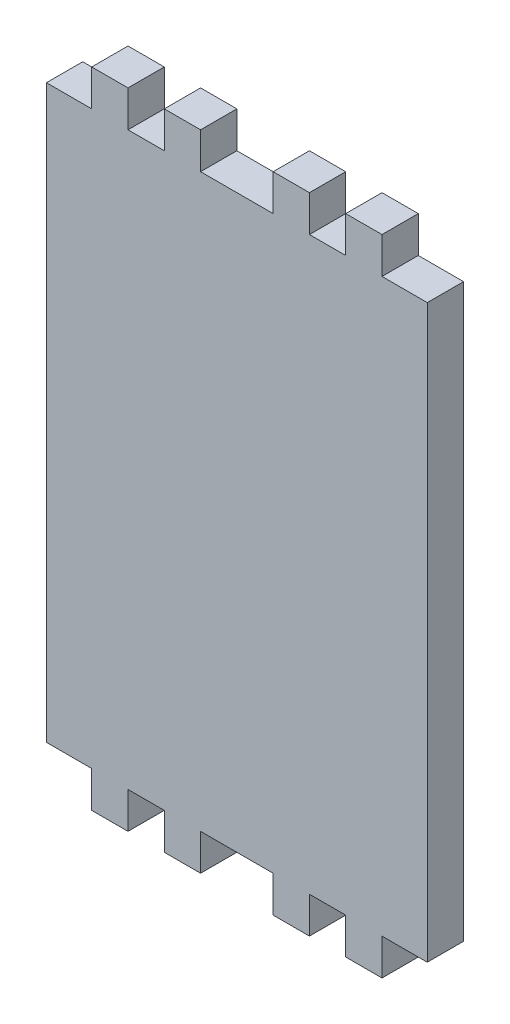
ISO-10303-21;
HEADER;
FILE_DESCRIPTION(('STEP AP214'),'2;1');
FILE_NAME('part.step','',(''),(''),'','','');
FILE_SCHEMA(('AUTOMOTIVE_DESIGN { 1 0 10303 214 1 1 1 1 }'));
ENDSEC;
DATA;
#1=APPLICATION_CONTEXT('core data for automotive mechanical design processes');
#2=APPLICATION_PROTOCOL_DEFINITION('international standard','automotive_design',2000,#1);
#3=PRODUCT_CONTEXT('',#1,'mechanical');
#4=PRODUCT('Part','Part','',(#3));
#5=PRODUCT_RELATED_PRODUCT_CATEGORY('part','',(#4));
#6=PRODUCT_DEFINITION_FORMATION('','',#4);
#7=PRODUCT_DEFINITION_CONTEXT('part definition',#1,'design');
#8=PRODUCT_DEFINITION('design','',#6,#7);
#9=PRODUCT_DEFINITION_SHAPE('','',#8);
#10=(LENGTH_UNIT() NAMED_UNIT(*) SI_UNIT(.MILLI.,.METRE.));
#11=(NAMED_UNIT(*) PLANE_ANGLE_UNIT() SI_UNIT($,.RADIAN.));
#12=(NAMED_UNIT(*) SI_UNIT($,.STERADIAN.) SOLID_ANGLE_UNIT());
#13=UNCERTAINTY_MEASURE_WITH_UNIT(LENGTH_MEASURE(1.E-05),#10,'distance_accuracy_value','');
#14=(GEOMETRIC_REPRESENTATION_CONTEXT(3) GLOBAL_UNCERTAINTY_ASSIGNED_CONTEXT((#13)) GLOBAL_UNIT_ASSIGNED_CONTEXT((#10,
#11,#12)) REPRESENTATION_CONTEXT('',''));
#15=CARTESIAN_POINT('',(0.,0.,0.));
#16=DIRECTION('',(0.,0.,1.));
#17=DIRECTION('',(1.,0.,0.));
#18=AXIS2_PLACEMENT_3D('',#15,#16,#17);
#19=CARTESIAN_POINT('',(-6.95478260869565,-36.6285217391304,5.08));
#20=DIRECTION('',(0.,1.,0.));
#21=DIRECTION('',(0.,0.,1.));
#22=AXIS2_PLACEMENT_3D('',#19,#20,#21);
#23=PLANE('',#22);
#24=DIRECTION('',(1.,0.,0.));
#25=VECTOR('',#24,1.);
#26=CARTESIAN_POINT('',(-6.95478260869565,-36.6285217391304,0.));
#27=LINE('',#26,#25);
#28=CARTESIAN_POINT('',(14.6252173913043,-36.6285217391304,0.));
#29=VERTEX_POINT('',#28);
#30=CARTESIAN_POINT('',(24.7852173913043,-36.6285217391304,0.));
#31=VERTEX_POINT('',#30);
#32=EDGE_CURVE('E519',#29,#31,#27,.T.);
#33=ORIENTED_EDGE('',*,*,#32,.T.);
#34=DIRECTION('',(0.,0.,1.));
#35=VECTOR('',#34,1.);
#36=CARTESIAN_POINT('',(24.7852173913043,-36.6285217391304,0.));
#37=LINE('',#36,#35);
#38=CARTESIAN_POINT('',(24.7852173913043,-36.6285217391304,5.08));
#39=VERTEX_POINT('',#38);
#40=EDGE_CURVE('E55',#31,#39,#37,.T.);
#41=ORIENTED_EDGE('',*,*,#40,.T.);
#42=DIRECTION('',(1.,0.,0.));
#43=VECTOR('',#42,1.);
#44=CARTESIAN_POINT('',(-6.95478260869565,-36.6285217391304,5.08));
#45=LINE('',#44,#43);
#46=CARTESIAN_POINT('',(14.6252173913043,-36.6285217391304,5.08));
#47=VERTEX_POINT('',#46);
#48=EDGE_CURVE('E503',#47,#39,#45,.T.);
#49=ORIENTED_EDGE('',*,*,#48,.F.);
#50=DIRECTION('',(0.,0.,1.));
#51=VECTOR('',#50,1.);
#52=CARTESIAN_POINT('',(14.6252173913043,-36.6285217391304,0.));
#53=LINE('',#52,#51);
#54=EDGE_CURVE('E368',#29,#47,#53,.T.);
#55=ORIENTED_EDGE('',*,*,#54,.F.);
#56=EDGE_LOOP('',(#33,#41,#49,#55));
#57=FACE_BOUND('',#56,.T.);
#58=ADVANCED_FACE('F32',(#57),#23,.F.);
#59=CARTESIAN_POINT('',(40.0252173913043,-36.6285217391304,5.08));
#60=VERTEX_POINT('',#59);
#61=CARTESIAN_POINT('',(46.3652173913043,-36.6285217391304,5.08));
#62=VERTEX_POINT('',#61);
#63=EDGE_CURVE('E496',#60,#62,#45,.T.);
#64=ORIENTED_EDGE('',*,*,#63,.F.);
#65=DIRECTION('',(0.,0.,1.));
#66=VECTOR('',#65,1.);
#67=CARTESIAN_POINT('',(40.0252173913043,-36.6285217391304,0.));
#68=LINE('',#67,#66);
#69=CARTESIAN_POINT('',(40.0252173913043,-36.6285217391304,0.));
#70=VERTEX_POINT('',#69);
#71=EDGE_CURVE('E323',#70,#60,#68,.T.);
#72=ORIENTED_EDGE('',*,*,#71,.F.);
#73=CARTESIAN_POINT('',(46.3652173913043,-36.6285217391304,0.));
#74=VERTEX_POINT('',#73);
#75=EDGE_CURVE('E514',#70,#74,#27,.T.);
#76=ORIENTED_EDGE('',*,*,#75,.T.);
#77=DIRECTION('',(0.,0.,-1.));
#78=VECTOR('',#77,1.);
#79=CARTESIAN_POINT('',(46.3652173913043,-36.6285217391304,5.08));
#80=LINE('',#79,#78);
#81=EDGE_CURVE('E40',#62,#74,#80,.T.);
#82=ORIENTED_EDGE('',*,*,#81,.F.);
#83=EDGE_LOOP('',(#64,#72,#76,#82));
#84=FACE_BOUND('',#83,.T.);
#85=ADVANCED_FACE('F624',(#84),#23,.F.);
#86=CARTESIAN_POINT('',(4.46521739130434,-36.6285217391304,5.08));
#87=VERTEX_POINT('',#86);
#88=CARTESIAN_POINT('',(9.54521739130433,-36.6285217391304,5.08));
#89=VERTEX_POINT('',#88);
#90=EDGE_CURVE('E502',#87,#89,#45,.T.);
#91=ORIENTED_EDGE('',*,*,#90,.F.);
#92=DIRECTION('',(0.,0.,1.));
#93=VECTOR('',#92,1.);
#94=CARTESIAN_POINT('',(4.46521739130434,-36.6285217391304,0.));
#95=LINE('',#94,#93);
#96=CARTESIAN_POINT('',(4.46521739130434,-36.6285217391304,0.));
#97=VERTEX_POINT('',#96);
#98=EDGE_CURVE('E342',#97,#87,#95,.T.);
#99=ORIENTED_EDGE('',*,*,#98,.F.);
#100=CARTESIAN_POINT('',(9.54521739130433,-36.6285217391304,0.));
#101=VERTEX_POINT('',#100);
#102=EDGE_CURVE('E518',#97,#101,#27,.T.);
#103=ORIENTED_EDGE('',*,*,#102,.T.);
#104=DIRECTION('',(0.,0.,1.));
#105=VECTOR('',#104,1.);
#106=CARTESIAN_POINT('',(9.54521739130433,-36.6285217391304,0.));
#107=LINE('',#106,#105);
#108=EDGE_CURVE('E381',#101,#89,#107,.T.);
#109=ORIENTED_EDGE('',*,*,#108,.T.);
#110=EDGE_LOOP('',(#91,#99,#103,#109));
#111=FACE_BOUND('',#110,.T.);
#112=ADVANCED_FACE('F610',(#111),#23,.F.);
#113=CARTESIAN_POINT('',(29.8652173913043,-36.6285217391304,5.08));
#114=VERTEX_POINT('',#113);
#115=CARTESIAN_POINT('',(34.9452173913043,-36.6285217391304,5.08));
#116=VERTEX_POINT('',#115);
#117=EDGE_CURVE('E47',#114,#116,#45,.T.);
#118=ORIENTED_EDGE('',*,*,#117,.F.);
#119=DIRECTION('',(0.,0.,1.));
#120=VECTOR('',#119,1.);
#121=CARTESIAN_POINT('',(29.8652173913043,-36.6285217391304,0.));
#122=LINE('',#121,#120);
#123=CARTESIAN_POINT('',(29.8652173913043,-36.6285217391304,0.));
#124=VERTEX_POINT('',#123);
#125=EDGE_CURVE('E277',#124,#114,#122,.T.);
#126=ORIENTED_EDGE('',*,*,#125,.F.);
#127=CARTESIAN_POINT('',(34.9452173913043,-36.6285217391304,0.));
#128=VERTEX_POINT('',#127);
#129=EDGE_CURVE('E288',#124,#128,#27,.T.);
#130=ORIENTED_EDGE('',*,*,#129,.T.);
#131=DIRECTION('',(0.,0.,1.));
#132=VECTOR('',#131,1.);
#133=CARTESIAN_POINT('',(34.9452173913043,-36.6285217391304,0.));
#134=LINE('',#133,#132);
#135=EDGE_CURVE('E315',#128,#116,#134,.T.);
#136=ORIENTED_EDGE('',*,*,#135,.T.);
#137=EDGE_LOOP('',(#118,#126,#130,#136));
#138=FACE_BOUND('',#137,.T.);
#139=ADVANCED_FACE('F614',(#138),#23,.F.);
#140=CARTESIAN_POINT('',(-6.95478260869566,43.3514782608696,5.08));
#141=DIRECTION('',(0.,-1.,0.));
#142=DIRECTION('',(0.,0.,-1.));
#143=AXIS2_PLACEMENT_3D('',#140,#141,#142);
#144=PLANE('',#143);
#145=DIRECTION('',(-1.,0.,0.));
#146=VECTOR('',#145,1.);
#147=CARTESIAN_POINT('',(-6.95478260869566,43.3514782608696,0.));
#148=LINE('',#147,#146);
#149=CARTESIAN_POINT('',(24.7852173913043,43.3514782608696,0.));
#150=VERTEX_POINT('',#149);
#151=CARTESIAN_POINT('',(14.6252173913043,43.3514782608696,0.));
#152=VERTEX_POINT('',#151);
#153=EDGE_CURVE('E580',#150,#152,#148,.T.);
#154=ORIENTED_EDGE('',*,*,#153,.T.);
#155=DIRECTION('',(0.,0.,1.));
#156=VECTOR('',#155,1.);
#157=CARTESIAN_POINT('',(14.6252173913043,43.3514782608696,0.));
#158=LINE('',#157,#156);
#159=CARTESIAN_POINT('',(14.6252173913043,43.3514782608696,5.08));
#160=VERTEX_POINT('',#159);
#161=EDGE_CURVE('E406',#152,#160,#158,.T.);
#162=ORIENTED_EDGE('',*,*,#161,.T.);
#163=DIRECTION('',(-1.,0.,0.));
#164=VECTOR('',#163,1.);
#165=CARTESIAN_POINT('',(-6.95478260869566,43.3514782608696,5.08));
#166=LINE('',#165,#164);
#167=CARTESIAN_POINT('',(24.7852173913043,43.3514782608696,5.08));
#168=VERTEX_POINT('',#167);
#169=EDGE_CURVE('E562',#168,#160,#166,.T.);
#170=ORIENTED_EDGE('',*,*,#169,.F.);
#171=DIRECTION('',(0.,0.,1.));
#172=VECTOR('',#171,1.);
#173=CARTESIAN_POINT('',(24.7852173913043,43.3514782608696,0.));
#174=LINE('',#173,#172);
#175=EDGE_CURVE('E449',#150,#168,#174,.T.);
#176=ORIENTED_EDGE('',*,*,#175,.F.);
#177=EDGE_LOOP('',(#154,#162,#170,#176));
#178=FACE_BOUND('',#177,.T.);
#179=ADVANCED_FACE('F579',(#178),#144,.F.);
#180=CARTESIAN_POINT('',(34.9452173913043,43.3514782608696,5.08));
#181=VERTEX_POINT('',#180);
#182=CARTESIAN_POINT('',(29.8652173913043,43.3514782608696,5.08));
#183=VERTEX_POINT('',#182);
#184=EDGE_CURVE('E510',#181,#183,#166,.T.);
#185=ORIENTED_EDGE('',*,*,#184,.F.);
#186=DIRECTION('',(0.,0.,1.));
#187=VECTOR('',#186,1.);
#188=CARTESIAN_POINT('',(34.9452173913043,43.3514782608696,0.));
#189=LINE('',#188,#187);
#190=CARTESIAN_POINT('',(34.9452173913043,43.3514782608696,0.));
#191=VERTEX_POINT('',#190);
#192=EDGE_CURVE('E422',#191,#181,#189,.T.);
#193=ORIENTED_EDGE('',*,*,#192,.F.);
#194=CARTESIAN_POINT('',(29.8652173913043,43.3514782608696,0.));
#195=VERTEX_POINT('',#194);
#196=EDGE_CURVE('E523',#191,#195,#148,.T.);
#197=ORIENTED_EDGE('',*,*,#196,.T.);
#198=DIRECTION('',(0.,0.,1.));
#199=VECTOR('',#198,1.);
#200=CARTESIAN_POINT('',(29.8652173913043,43.3514782608696,0.));
#201=LINE('',#200,#199);
#202=EDGE_CURVE('E462',#195,#183,#201,.T.);
#203=ORIENTED_EDGE('',*,*,#202,.T.);
#204=EDGE_LOOP('',(#185,#193,#197,#203));
#205=FACE_BOUND('',#204,.T.);
#206=ADVANCED_FACE('F564',(#205),#144,.F.);
#207=CARTESIAN_POINT('',(9.54521739130433,43.3514782608696,5.08));
#208=VERTEX_POINT('',#207);
#209=CARTESIAN_POINT('',(4.46521739130434,43.3514782608696,5.08));
#210=VERTEX_POINT('',#209);
#211=EDGE_CURVE('E511',#208,#210,#166,.T.);
#212=ORIENTED_EDGE('',*,*,#211,.F.);
#213=DIRECTION('',(0.,0.,1.));
#214=VECTOR('',#213,1.);
#215=CARTESIAN_POINT('',(9.54521739130433,43.3514782608696,0.));
#216=LINE('',#215,#214);
#217=CARTESIAN_POINT('',(9.54521739130433,43.3514782608696,0.));
#218=VERTEX_POINT('',#217);
#219=EDGE_CURVE('E408',#218,#208,#216,.T.);
#220=ORIENTED_EDGE('',*,*,#219,.F.);
#221=CARTESIAN_POINT('',(4.46521739130434,43.3514782608696,0.));
#222=VERTEX_POINT('',#221);
#223=EDGE_CURVE('E524',#218,#222,#148,.T.);
#224=ORIENTED_EDGE('',*,*,#223,.T.);
#225=DIRECTION('',(0.,0.,1.));
#226=VECTOR('',#225,1.);
#227=CARTESIAN_POINT('',(4.46521739130434,43.3514782608696,0.));
#228=LINE('',#227,#226);
#229=EDGE_CURVE('E476',#222,#210,#228,.T.);
#230=ORIENTED_EDGE('',*,*,#229,.T.);
#231=EDGE_LOOP('',(#212,#220,#224,#230));
#232=FACE_BOUND('',#231,.T.);
#233=ADVANCED_FACE('F646',(#232),#144,.F.);
#234=DIRECTION('',(0.,0.,1.));
#235=VECTOR('',#234,1.);
#236=CARTESIAN_POINT('',(-0.614782608695664,43.3514782608696,0.));
#237=LINE('',#236,#235);
#238=CARTESIAN_POINT('',(-0.614782608695664,43.3514782608696,0.));
#239=VERTEX_POINT('',#238);
#240=CARTESIAN_POINT('',(-0.614782608695664,43.3514782608696,5.08));
#241=VERTEX_POINT('',#240);
#242=EDGE_CURVE('E484',#239,#241,#237,.T.);
#243=ORIENTED_EDGE('',*,*,#242,.F.);
#244=CARTESIAN_POINT('',(-6.95478260869566,43.3514782608696,0.));
#245=VERTEX_POINT('',#244);
#246=EDGE_CURVE('E521',#239,#245,#148,.T.);
#247=ORIENTED_EDGE('',*,*,#246,.T.);
#248=DIRECTION('',(0.,0.,-1.));
#249=VECTOR('',#248,1.);
#250=CARTESIAN_POINT('',(-6.95478260869566,43.3514782608696,5.08));
#251=LINE('',#250,#249);
#252=CARTESIAN_POINT('',(-6.95478260869566,43.3514782608696,5.08));
#253=VERTEX_POINT('',#252);
#254=EDGE_CURVE('E509',#253,#245,#251,.T.);
#255=ORIENTED_EDGE('',*,*,#254,.F.);
#256=EDGE_CURVE('E505',#241,#253,#166,.T.);
#257=ORIENTED_EDGE('',*,*,#256,.F.);
#258=EDGE_LOOP('',(#243,#247,#255,#257));
#259=FACE_BOUND('',#258,.T.);
#260=ADVANCED_FACE('F589',(#259),#144,.F.);
#261=CARTESIAN_POINT('',(-6.95478260869566,43.3514782608696,5.08));
#262=DIRECTION('',(1.,0.,0.));
#263=DIRECTION('',(0.,1.,0.));
#264=AXIS2_PLACEMENT_3D('',#261,#262,#263);
#265=PLANE('',#264);
#266=DIRECTION('',(0.,-1.,0.));
#267=VECTOR('',#266,1.);
#268=CARTESIAN_POINT('',(-6.95478260869566,43.3514782608696,0.));
#269=LINE('',#268,#267);
#270=CARTESIAN_POINT('',(-6.95478260869565,-36.6285217391304,0.));
#271=VERTEX_POINT('',#270);
#272=EDGE_CURVE('E486',#245,#271,#269,.T.);
#273=ORIENTED_EDGE('',*,*,#272,.T.);
#274=DIRECTION('',(0.,0.,-1.));
#275=VECTOR('',#274,1.);
#276=CARTESIAN_POINT('',(-6.95478260869565,-36.6285217391304,5.08));
#277=LINE('',#276,#275);
#278=CARTESIAN_POINT('',(-6.95478260869565,-36.6285217391304,5.08));
#279=VERTEX_POINT('',#278);
#280=EDGE_CURVE('E11',#279,#271,#277,.T.);
#281=ORIENTED_EDGE('',*,*,#280,.F.);
#282=DIRECTION('',(0.,-1.,0.));
#283=VECTOR('',#282,1.);
#284=CARTESIAN_POINT('',(-6.95478260869566,43.3514782608696,5.08));
#285=LINE('',#284,#283);
#286=EDGE_CURVE('E493',#253,#279,#285,.T.);
#287=ORIENTED_EDGE('',*,*,#286,.F.);
#288=ORIENTED_EDGE('',*,*,#254,.T.);
#289=EDGE_LOOP('',(#273,#281,#287,#288));
#290=FACE_BOUND('',#289,.T.);
#291=ADVANCED_FACE('F34',(#290),#265,.F.);
#292=CARTESIAN_POINT('',(-0.614782608695664,-36.6285217391304,0.));
#293=VERTEX_POINT('',#292);
#294=EDGE_CURVE('E515',#271,#293,#27,.T.);
#295=ORIENTED_EDGE('',*,*,#294,.T.);
#296=DIRECTION('',(0.,0.,1.));
#297=VECTOR('',#296,1.);
#298=CARTESIAN_POINT('',(-0.614782608695664,-36.6285217391304,0.));
#299=LINE('',#298,#297);
#300=CARTESIAN_POINT('',(-0.614782608695664,-36.6285217391304,5.08));
#301=VERTEX_POINT('',#300);
#302=EDGE_CURVE('E355',#293,#301,#299,.T.);
#303=ORIENTED_EDGE('',*,*,#302,.T.);
#304=EDGE_CURVE('E498',#279,#301,#45,.T.);
#305=ORIENTED_EDGE('',*,*,#304,.F.);
#306=ORIENTED_EDGE('',*,*,#280,.T.);
#307=EDGE_LOOP('',(#295,#303,#305,#306));
#308=FACE_BOUND('',#307,.T.);
#309=ADVANCED_FACE('F593',(#308),#23,.F.);
#310=CARTESIAN_POINT('',(46.3652173913043,43.3514782608696,5.08));
#311=DIRECTION('',(-1.,0.,0.));
#312=DIRECTION('',(0.,-1.,0.));
#313=AXIS2_PLACEMENT_3D('',#310,#311,#312);
#314=PLANE('',#313);
#315=DIRECTION('',(0.,1.,0.));
#316=VECTOR('',#315,1.);
#317=CARTESIAN_POINT('',(46.3652173913043,43.3514782608696,0.));
#318=LINE('',#317,#316);
#319=CARTESIAN_POINT('',(46.3652173913043,43.3514782608696,0.));
#320=VERTEX_POINT('',#319);
#321=EDGE_CURVE('E517',#74,#320,#318,.T.);
#322=ORIENTED_EDGE('',*,*,#321,.T.);
#323=DIRECTION('',(0.,0.,-1.));
#324=VECTOR('',#323,1.);
#325=CARTESIAN_POINT('',(46.3652173913043,43.3514782608696,5.08));
#326=LINE('',#325,#324);
#327=CARTESIAN_POINT('',(46.3652173913043,43.3514782608696,5.08));
#328=VERTEX_POINT('',#327);
#329=EDGE_CURVE('E527',#328,#320,#326,.T.);
#330=ORIENTED_EDGE('',*,*,#329,.F.);
#331=DIRECTION('',(0.,1.,0.));
#332=VECTOR('',#331,1.);
#333=CARTESIAN_POINT('',(46.3652173913043,43.3514782608696,5.08));
#334=LINE('',#333,#332);
#335=EDGE_CURVE('E501',#62,#328,#334,.T.);
#336=ORIENTED_EDGE('',*,*,#335,.F.);
#337=ORIENTED_EDGE('',*,*,#81,.T.);
#338=EDGE_LOOP('',(#322,#330,#336,#337));
#339=FACE_BOUND('',#338,.T.);
#340=ADVANCED_FACE('F534',(#339),#314,.F.);
#341=CARTESIAN_POINT('',(40.0252173913043,43.3514782608696,0.));
#342=VERTEX_POINT('',#341);
#343=EDGE_CURVE('E497',#320,#342,#148,.T.);
#344=ORIENTED_EDGE('',*,*,#343,.T.);
#345=DIRECTION('',(0.,0.,1.));
#346=VECTOR('',#345,1.);
#347=CARTESIAN_POINT('',(40.0252173913043,43.3514782608696,0.));
#348=LINE('',#347,#346);
#349=CARTESIAN_POINT('',(40.0252173913043,43.3514782608696,5.08));
#350=VERTEX_POINT('',#349);
#351=EDGE_CURVE('E435',#342,#350,#348,.T.);
#352=ORIENTED_EDGE('',*,*,#351,.T.);
#353=EDGE_CURVE('E506',#328,#350,#166,.T.);
#354=ORIENTED_EDGE('',*,*,#353,.F.);
#355=ORIENTED_EDGE('',*,*,#329,.T.);
#356=EDGE_LOOP('',(#344,#352,#354,#355));
#357=FACE_BOUND('',#356,.T.);
#358=ADVANCED_FACE('F544',(#357),#144,.F.);
#359=CARTESIAN_POINT('',(0.,0.,5.08));
#360=DIRECTION('',(0.,0.,1.));
#361=DIRECTION('',(1.,0.,0.));
#362=AXIS2_PLACEMENT_3D('',#359,#360,#361);
#363=PLANE('',#362);
#364=ORIENTED_EDGE('',*,*,#286,.T.);
#365=ORIENTED_EDGE('',*,*,#304,.T.);
#366=DIRECTION('',(0.,-1.,0.));
#367=VECTOR('',#366,1.);
#368=CARTESIAN_POINT('',(-0.614782608695664,-36.6285217391304,5.08));
#369=LINE('',#368,#367);
#370=CARTESIAN_POINT('',(-0.614782608695664,-41.7085217391304,5.08));
#371=VERTEX_POINT('',#370);
#372=EDGE_CURVE('E345',#301,#371,#369,.T.);
#373=ORIENTED_EDGE('',*,*,#372,.T.);
#374=DIRECTION('',(1.,0.,0.));
#375=VECTOR('',#374,1.);
#376=CARTESIAN_POINT('',(4.46521739130434,-41.7085217391304,5.08));
#377=LINE('',#376,#375);
#378=CARTESIAN_POINT('',(4.46521739130434,-41.7085217391304,5.08));
#379=VERTEX_POINT('',#378);
#380=EDGE_CURVE('E336',#371,#379,#377,.T.);
#381=ORIENTED_EDGE('',*,*,#380,.T.);
#382=DIRECTION('',(0.,1.,0.));
#383=VECTOR('',#382,1.);
#384=CARTESIAN_POINT('',(4.46521739130434,-36.6285217391304,5.08));
#385=LINE('',#384,#383);
#386=EDGE_CURVE('E326',#379,#87,#385,.T.);
#387=ORIENTED_EDGE('',*,*,#386,.T.);
#388=ORIENTED_EDGE('',*,*,#90,.T.);
#389=DIRECTION('',(0.,-1.,0.));
#390=VECTOR('',#389,1.);
#391=CARTESIAN_POINT('',(9.54521739130433,-41.7085217391304,5.08));
#392=LINE('',#391,#390);
#393=CARTESIAN_POINT('',(9.54521739130433,-41.7085217391304,5.08));
#394=VERTEX_POINT('',#393);
#395=EDGE_CURVE('E371',#89,#394,#392,.T.);
#396=ORIENTED_EDGE('',*,*,#395,.T.);
#397=DIRECTION('',(1.,0.,0.));
#398=VECTOR('',#397,1.);
#399=CARTESIAN_POINT('',(14.6252173913043,-41.7085217391304,5.08));
#400=LINE('',#399,#398);
#401=CARTESIAN_POINT('',(14.6252173913043,-41.7085217391304,5.08));
#402=VERTEX_POINT('',#401);
#403=EDGE_CURVE('E362',#394,#402,#400,.T.);
#404=ORIENTED_EDGE('',*,*,#403,.T.);
#405=DIRECTION('',(0.,1.,0.));
#406=VECTOR('',#405,1.);
#407=CARTESIAN_POINT('',(14.6252173913043,-41.7085217391304,5.08));
#408=LINE('',#407,#406);
#409=EDGE_CURVE('E352',#402,#47,#408,.T.);
#410=ORIENTED_EDGE('',*,*,#409,.T.);
#411=ORIENTED_EDGE('',*,*,#48,.T.);
#412=DIRECTION('',(0.,-1.,0.));
#413=VECTOR('',#412,1.);
#414=CARTESIAN_POINT('',(24.7852173913043,-41.7085217391304,5.08));
#415=LINE('',#414,#413);
#416=CARTESIAN_POINT('',(24.7852173913043,-41.7085217391304,5.08));
#417=VERTEX_POINT('',#416);
#418=EDGE_CURVE('E292',#39,#417,#415,.T.);
#419=ORIENTED_EDGE('',*,*,#418,.T.);
#420=DIRECTION('',(1.,0.,0.));
#421=VECTOR('',#420,1.);
#422=CARTESIAN_POINT('',(24.7852173913043,-41.7085217391304,5.08));
#423=LINE('',#422,#421);
#424=CARTESIAN_POINT('',(29.8652173913043,-41.7085217391304,5.08));
#425=VERTEX_POINT('',#424);
#426=EDGE_CURVE('E298',#417,#425,#423,.T.);
#427=ORIENTED_EDGE('',*,*,#426,.T.);
#428=DIRECTION('',(0.,1.,0.));
#429=VECTOR('',#428,1.);
#430=CARTESIAN_POINT('',(29.8652173913043,-41.7085217391304,5.08));
#431=LINE('',#430,#429);
#432=EDGE_CURVE('E272',#425,#114,#431,.T.);
#433=ORIENTED_EDGE('',*,*,#432,.T.);
#434=ORIENTED_EDGE('',*,*,#117,.T.);
#435=DIRECTION('',(0.,-1.,0.));
#436=VECTOR('',#435,1.);
#437=CARTESIAN_POINT('',(34.9452173913043,-36.6285217391304,5.08));
#438=LINE('',#437,#436);
#439=CARTESIAN_POINT('',(34.9452173913043,-41.7085217391304,5.08));
#440=VERTEX_POINT('',#439);
#441=EDGE_CURVE('E302',#116,#440,#438,.T.);
#442=ORIENTED_EDGE('',*,*,#441,.T.);
#443=DIRECTION('',(1.,0.,0.));
#444=VECTOR('',#443,1.);
#445=CARTESIAN_POINT('',(34.9452173913043,-41.7085217391304,5.08));
#446=LINE('',#445,#444);
#447=CARTESIAN_POINT('',(40.0252173913043,-41.7085217391304,5.08));
#448=VERTEX_POINT('',#447);
#449=EDGE_CURVE('E318',#440,#448,#446,.T.);
#450=ORIENTED_EDGE('',*,*,#449,.T.);
#451=DIRECTION('',(0.,1.,0.));
#452=VECTOR('',#451,1.);
#453=CARTESIAN_POINT('',(40.0252173913043,-36.6285217391304,5.08));
#454=LINE('',#453,#452);
#455=EDGE_CURVE('E309',#448,#60,#454,.T.);
#456=ORIENTED_EDGE('',*,*,#455,.T.);
#457=ORIENTED_EDGE('',*,*,#63,.T.);
#458=ORIENTED_EDGE('',*,*,#335,.T.);
#459=ORIENTED_EDGE('',*,*,#353,.T.);
#460=DIRECTION('',(0.,1.,0.));
#461=VECTOR('',#460,1.);
#462=CARTESIAN_POINT('',(40.0252173913043,43.3514782608696,5.08));
#463=LINE('',#462,#461);
#464=CARTESIAN_POINT('',(40.0252173913043,48.4314782608696,5.08));
#465=VERTEX_POINT('',#464);
#466=EDGE_CURVE('E425',#350,#465,#463,.T.);
#467=ORIENTED_EDGE('',*,*,#466,.T.);
#468=DIRECTION('',(-1.,0.,0.));
#469=VECTOR('',#468,1.);
#470=CARTESIAN_POINT('',(34.9452173913043,48.4314782608696,5.08));
#471=LINE('',#470,#469);
#472=CARTESIAN_POINT('',(34.9452173913043,48.4314782608696,5.08));
#473=VERTEX_POINT('',#472);
#474=EDGE_CURVE('E416',#465,#473,#471,.T.);
#475=ORIENTED_EDGE('',*,*,#474,.T.);
#476=DIRECTION('',(0.,-1.,0.));
#477=VECTOR('',#476,1.);
#478=CARTESIAN_POINT('',(34.9452173913043,43.3514782608696,5.08));
#479=LINE('',#478,#477);
#480=EDGE_CURVE('E405',#473,#181,#479,.T.);
#481=ORIENTED_EDGE('',*,*,#480,.T.);
#482=ORIENTED_EDGE('',*,*,#184,.T.);
#483=DIRECTION('',(0.,1.,0.));
#484=VECTOR('',#483,1.);
#485=CARTESIAN_POINT('',(29.8652173913043,48.4314782608696,5.08));
#486=LINE('',#485,#484);
#487=CARTESIAN_POINT('',(29.8652173913043,48.4314782608696,5.08));
#488=VERTEX_POINT('',#487);
#489=EDGE_CURVE('E452',#183,#488,#486,.T.);
#490=ORIENTED_EDGE('',*,*,#489,.T.);
#491=DIRECTION('',(-1.,0.,0.));
#492=VECTOR('',#491,1.);
#493=CARTESIAN_POINT('',(24.7852173913043,48.4314782608696,5.08));
#494=LINE('',#493,#492);
#495=CARTESIAN_POINT('',(24.7852173913043,48.4314782608696,5.08));
#496=VERTEX_POINT('',#495);
#497=EDGE_CURVE('E443',#488,#496,#494,.T.);
#498=ORIENTED_EDGE('',*,*,#497,.T.);
#499=DIRECTION('',(0.,-1.,0.));
#500=VECTOR('',#499,1.);
#501=CARTESIAN_POINT('',(24.7852173913043,48.4314782608696,5.08));
#502=LINE('',#501,#500);
#503=EDGE_CURVE('E432',#496,#168,#502,.T.);
#504=ORIENTED_EDGE('',*,*,#503,.T.);
#505=ORIENTED_EDGE('',*,*,#169,.T.);
#506=DIRECTION('',(0.,1.,0.));
#507=VECTOR('',#506,1.);
#508=CARTESIAN_POINT('',(14.6252173913043,48.4314782608696,5.08));
#509=LINE('',#508,#507);
#510=CARTESIAN_POINT('',(14.6252173913043,48.4314782608696,5.08));
#511=VERTEX_POINT('',#510);
#512=EDGE_CURVE('E389',#160,#511,#509,.T.);
#513=ORIENTED_EDGE('',*,*,#512,.T.);
#514=DIRECTION('',(-1.,0.,0.));
#515=VECTOR('',#514,1.);
#516=CARTESIAN_POINT('',(14.6252173913043,48.4314782608696,5.08));
#517=LINE('',#516,#515);
#518=CARTESIAN_POINT('',(9.54521739130433,48.4314782608696,5.08));
#519=VERTEX_POINT('',#518);
#520=EDGE_CURVE('E378',#511,#519,#517,.T.);
#521=ORIENTED_EDGE('',*,*,#520,.T.);
#522=DIRECTION('',(0.,-1.,0.));
#523=VECTOR('',#522,1.);
#524=CARTESIAN_POINT('',(9.54521739130433,48.4314782608696,5.08));
#525=LINE('',#524,#523);
#526=EDGE_CURVE('E398',#519,#208,#525,.T.);
#527=ORIENTED_EDGE('',*,*,#526,.T.);
#528=ORIENTED_EDGE('',*,*,#211,.T.);
#529=DIRECTION('',(0.,1.,0.));
#530=VECTOR('',#529,1.);
#531=CARTESIAN_POINT('',(4.46521739130434,43.3514782608696,5.08));
#532=LINE('',#531,#530);
#533=CARTESIAN_POINT('',(4.46521739130434,48.4314782608696,5.08));
#534=VERTEX_POINT('',#533);
#535=EDGE_CURVE('E459',#210,#534,#532,.T.);
#536=ORIENTED_EDGE('',*,*,#535,.T.);
#537=DIRECTION('',(-1.,0.,0.));
#538=VECTOR('',#537,1.);
#539=CARTESIAN_POINT('',(4.46521739130434,48.4314782608696,5.08));
#540=LINE('',#539,#538);
#541=CARTESIAN_POINT('',(-0.614782608695664,48.4314782608696,5.08));
#542=VERTEX_POINT('',#541);
#543=EDGE_CURVE('E479',#534,#542,#540,.T.);
#544=ORIENTED_EDGE('',*,*,#543,.T.);
#545=DIRECTION('',(0.,-1.,0.));
#546=VECTOR('',#545,1.);
#547=CARTESIAN_POINT('',(-0.614782608695664,43.3514782608696,5.08));
#548=LINE('',#547,#546);
#549=EDGE_CURVE('E471',#542,#241,#548,.T.);
#550=ORIENTED_EDGE('',*,*,#549,.T.);
#551=ORIENTED_EDGE('',*,*,#256,.T.);
#552=EDGE_LOOP('',(#364,#365,#373,#381,#387,#388,#396,#404,#410,#411,#419,#427,#433,#434,#442,
#450,#456,#457,#458,#459,#467,#475,#481,#482,#490,#498,#504,#505,#513,#521,#527,#528,#536,#544,
#550,#551));
#553=FACE_BOUND('',#552,.T.);
#554=ADVANCED_FACE('F551',(#553),#363,.T.);
#555=CARTESIAN_POINT('',(0.,0.,0.));
#556=DIRECTION('',(0.,0.,1.));
#557=DIRECTION('',(1.,0.,0.));
#558=AXIS2_PLACEMENT_3D('',#555,#556,#557);
#559=PLANE('',#558);
#560=ORIENTED_EDGE('',*,*,#272,.F.);
#561=ORIENTED_EDGE('',*,*,#246,.F.);
#562=DIRECTION('',(0.,-1.,0.));
#563=VECTOR('',#562,1.);
#564=CARTESIAN_POINT('',(-0.614782608695664,43.3514782608696,0.));
#565=LINE('',#564,#563);
#566=CARTESIAN_POINT('',(-0.614782608695664,48.4314782608696,0.));
#567=VERTEX_POINT('',#566);
#568=EDGE_CURVE('E474',#567,#239,#565,.T.);
#569=ORIENTED_EDGE('',*,*,#568,.F.);
#570=DIRECTION('',(-1.,0.,0.));
#571=VECTOR('',#570,1.);
#572=CARTESIAN_POINT('',(4.46521739130434,48.4314782608696,0.));
#573=LINE('',#572,#571);
#574=CARTESIAN_POINT('',(4.46521739130434,48.4314782608696,0.));
#575=VERTEX_POINT('',#574);
#576=EDGE_CURVE('E470',#575,#567,#573,.T.);
#577=ORIENTED_EDGE('',*,*,#576,.F.);
#578=DIRECTION('',(0.,1.,0.));
#579=VECTOR('',#578,1.);
#580=CARTESIAN_POINT('',(4.46521739130434,43.3514782608696,0.));
#581=LINE('',#580,#579);
#582=EDGE_CURVE('E467',#222,#575,#581,.T.);
#583=ORIENTED_EDGE('',*,*,#582,.F.);
#584=ORIENTED_EDGE('',*,*,#223,.F.);
#585=DIRECTION('',(0.,-1.,0.));
#586=VECTOR('',#585,1.);
#587=CARTESIAN_POINT('',(9.54521739130433,48.4314782608696,0.));
#588=LINE('',#587,#586);
#589=CARTESIAN_POINT('',(9.54521739130433,48.4314782608696,0.));
#590=VERTEX_POINT('',#589);
#591=EDGE_CURVE('E388',#590,#218,#588,.T.);
#592=ORIENTED_EDGE('',*,*,#591,.F.);
#593=DIRECTION('',(-1.,0.,0.));
#594=VECTOR('',#593,1.);
#595=CARTESIAN_POINT('',(14.6252173913043,48.4314782608696,0.));
#596=LINE('',#595,#594);
#597=CARTESIAN_POINT('',(14.6252173913043,48.4314782608696,0.));
#598=VERTEX_POINT('',#597);
#599=EDGE_CURVE('E385',#598,#590,#596,.T.);
#600=ORIENTED_EDGE('',*,*,#599,.F.);
#601=DIRECTION('',(0.,1.,0.));
#602=VECTOR('',#601,1.);
#603=CARTESIAN_POINT('',(14.6252173913043,48.4314782608696,0.));
#604=LINE('',#603,#602);
#605=EDGE_CURVE('E392',#152,#598,#604,.T.);
#606=ORIENTED_EDGE('',*,*,#605,.F.);
#607=ORIENTED_EDGE('',*,*,#153,.F.);
#608=DIRECTION('',(0.,-1.,0.));
#609=VECTOR('',#608,1.);
#610=CARTESIAN_POINT('',(24.7852173913043,48.4314782608696,0.));
#611=LINE('',#610,#609);
#612=CARTESIAN_POINT('',(24.7852173913043,48.4314782608696,0.));
#613=VERTEX_POINT('',#612);
#614=EDGE_CURVE('E439',#613,#150,#611,.T.);
#615=ORIENTED_EDGE('',*,*,#614,.F.);
#616=DIRECTION('',(-1.,0.,0.));
#617=VECTOR('',#616,1.);
#618=CARTESIAN_POINT('',(24.7852173913043,48.4314782608696,0.));
#619=LINE('',#618,#617);
#620=CARTESIAN_POINT('',(29.8652173913043,48.4314782608696,0.));
#621=VERTEX_POINT('',#620);
#622=EDGE_CURVE('E446',#621,#613,#619,.T.);
#623=ORIENTED_EDGE('',*,*,#622,.F.);
#624=DIRECTION('',(0.,1.,0.));
#625=VECTOR('',#624,1.);
#626=CARTESIAN_POINT('',(29.8652173913043,48.4314782608696,0.));
#627=LINE('',#626,#625);
#628=EDGE_CURVE('E442',#195,#621,#627,.T.);
#629=ORIENTED_EDGE('',*,*,#628,.F.);
#630=ORIENTED_EDGE('',*,*,#196,.F.);
#631=DIRECTION('',(0.,-1.,0.));
#632=VECTOR('',#631,1.);
#633=CARTESIAN_POINT('',(34.9452173913043,43.3514782608696,0.));
#634=LINE('',#633,#632);
#635=CARTESIAN_POINT('',(34.9452173913043,48.4314782608696,0.));
#636=VERTEX_POINT('',#635);
#637=EDGE_CURVE('E412',#636,#191,#634,.T.);
#638=ORIENTED_EDGE('',*,*,#637,.F.);
#639=DIRECTION('',(-1.,0.,0.));
#640=VECTOR('',#639,1.);
#641=CARTESIAN_POINT('',(34.9452173913043,48.4314782608696,0.));
#642=LINE('',#641,#640);
#643=CARTESIAN_POINT('',(40.0252173913043,48.4314782608696,0.));
#644=VERTEX_POINT('',#643);
#645=EDGE_CURVE('E419',#644,#636,#642,.T.);
#646=ORIENTED_EDGE('',*,*,#645,.F.);
#647=DIRECTION('',(0.,1.,0.));
#648=VECTOR('',#647,1.);
#649=CARTESIAN_POINT('',(40.0252173913043,43.3514782608696,0.));
#650=LINE('',#649,#648);
#651=EDGE_CURVE('E415',#342,#644,#650,.T.);
#652=ORIENTED_EDGE('',*,*,#651,.F.);
#653=ORIENTED_EDGE('',*,*,#343,.F.);
#654=ORIENTED_EDGE('',*,*,#321,.F.);
#655=ORIENTED_EDGE('',*,*,#75,.F.);
#656=DIRECTION('',(0.,1.,0.));
#657=VECTOR('',#656,1.);
#658=CARTESIAN_POINT('',(40.0252173913043,-36.6285217391304,0.));
#659=LINE('',#658,#657);
#660=CARTESIAN_POINT('',(40.0252173913043,-41.7085217391304,0.));
#661=VERTEX_POINT('',#660);
#662=EDGE_CURVE('E312',#661,#70,#659,.T.);
#663=ORIENTED_EDGE('',*,*,#662,.F.);
#664=DIRECTION('',(1.,0.,0.));
#665=VECTOR('',#664,1.);
#666=CARTESIAN_POINT('',(34.9452173913043,-41.7085217391304,0.));
#667=LINE('',#666,#665);
#668=CARTESIAN_POINT('',(34.9452173913043,-41.7085217391304,0.));
#669=VERTEX_POINT('',#668);
#670=EDGE_CURVE('E308',#669,#661,#667,.T.);
#671=ORIENTED_EDGE('',*,*,#670,.F.);
#672=DIRECTION('',(0.,-1.,0.));
#673=VECTOR('',#672,1.);
#674=CARTESIAN_POINT('',(34.9452173913043,-36.6285217391304,0.));
#675=LINE('',#674,#673);
#676=EDGE_CURVE('E305',#128,#669,#675,.T.);
#677=ORIENTED_EDGE('',*,*,#676,.F.);
#678=ORIENTED_EDGE('',*,*,#129,.F.);
#679=DIRECTION('',(0.,1.,0.));
#680=VECTOR('',#679,1.);
#681=CARTESIAN_POINT('',(29.8652173913043,-41.7085217391304,0.));
#682=LINE('',#681,#680);
#683=CARTESIAN_POINT('',(29.8652173913043,-41.7085217391304,0.));
#684=VERTEX_POINT('',#683);
#685=EDGE_CURVE('E270',#684,#124,#682,.T.);
#686=ORIENTED_EDGE('',*,*,#685,.F.);
#687=DIRECTION('',(1.,0.,0.));
#688=VECTOR('',#687,1.);
#689=CARTESIAN_POINT('',(24.7852173913043,-41.7085217391304,0.));
#690=LINE('',#689,#688);
#691=CARTESIAN_POINT('',(24.7852173913043,-41.7085217391304,0.));
#692=VERTEX_POINT('',#691);
#693=EDGE_CURVE('E285',#692,#684,#690,.T.);
#694=ORIENTED_EDGE('',*,*,#693,.F.);
#695=DIRECTION('',(0.,-1.,0.));
#696=VECTOR('',#695,1.);
#697=CARTESIAN_POINT('',(24.7852173913043,-41.7085217391304,0.));
#698=LINE('',#697,#696);
#699=EDGE_CURVE('E278',#31,#692,#698,.T.);
#700=ORIENTED_EDGE('',*,*,#699,.F.);
#701=ORIENTED_EDGE('',*,*,#32,.F.);
#702=DIRECTION('',(0.,1.,0.));
#703=VECTOR('',#702,1.);
#704=CARTESIAN_POINT('',(14.6252173913043,-41.7085217391304,0.));
#705=LINE('',#704,#703);
#706=CARTESIAN_POINT('',(14.6252173913043,-41.7085217391304,0.));
#707=VERTEX_POINT('',#706);
#708=EDGE_CURVE('E359',#707,#29,#705,.T.);
#709=ORIENTED_EDGE('',*,*,#708,.F.);
#710=DIRECTION('',(1.,0.,0.));
#711=VECTOR('',#710,1.);
#712=CARTESIAN_POINT('',(14.6252173913043,-41.7085217391304,0.));
#713=LINE('',#712,#711);
#714=CARTESIAN_POINT('',(9.54521739130433,-41.7085217391304,0.));
#715=VERTEX_POINT('',#714);
#716=EDGE_CURVE('E365',#715,#707,#713,.T.);
#717=ORIENTED_EDGE('',*,*,#716,.F.);
#718=DIRECTION('',(0.,-1.,0.));
#719=VECTOR('',#718,1.);
#720=CARTESIAN_POINT('',(9.54521739130433,-41.7085217391304,0.));
#721=LINE('',#720,#719);
#722=EDGE_CURVE('E361',#101,#715,#721,.T.);
#723=ORIENTED_EDGE('',*,*,#722,.F.);
#724=ORIENTED_EDGE('',*,*,#102,.F.);
#725=DIRECTION('',(0.,1.,0.));
#726=VECTOR('',#725,1.);
#727=CARTESIAN_POINT('',(4.46521739130434,-36.6285217391304,0.));
#728=LINE('',#727,#726);
#729=CARTESIAN_POINT('',(4.46521739130434,-41.7085217391304,0.));
#730=VERTEX_POINT('',#729);
#731=EDGE_CURVE('E332',#730,#97,#728,.T.);
#732=ORIENTED_EDGE('',*,*,#731,.F.);
#733=DIRECTION('',(1.,0.,0.));
#734=VECTOR('',#733,1.);
#735=CARTESIAN_POINT('',(4.46521739130434,-41.7085217391304,0.));
#736=LINE('',#735,#734);
#737=CARTESIAN_POINT('',(-0.614782608695664,-41.7085217391304,0.));
#738=VERTEX_POINT('',#737);
#739=EDGE_CURVE('E339',#738,#730,#736,.T.);
#740=ORIENTED_EDGE('',*,*,#739,.F.);
#741=DIRECTION('',(0.,-1.,0.));
#742=VECTOR('',#741,1.);
#743=CARTESIAN_POINT('',(-0.614782608695664,-36.6285217391304,0.));
#744=LINE('',#743,#742);
#745=EDGE_CURVE('E335',#293,#738,#744,.T.);
#746=ORIENTED_EDGE('',*,*,#745,.F.);
#747=ORIENTED_EDGE('',*,*,#294,.F.);
#748=EDGE_LOOP('',(#560,#561,#569,#577,#583,#584,#592,#600,#606,#607,#615,#623,#629,#630,#638,
#646,#652,#653,#654,#655,#663,#671,#677,#678,#686,#694,#700,#701,#709,#717,#723,#724,#732,#740,
#746,#747));
#749=FACE_BOUND('',#748,.T.);
#750=ADVANCED_FACE('F283',(#749),#559,.F.);
#751=CARTESIAN_POINT('',(-0.614782608695664,43.3514782608696,0.));
#752=DIRECTION('',(-1.,0.,0.));
#753=DIRECTION('',(0.,0.,1.));
#754=AXIS2_PLACEMENT_3D('',#751,#752,#753);
#755=PLANE('',#754);
#756=ORIENTED_EDGE('',*,*,#549,.F.);
#757=DIRECTION('',(0.,0.,1.));
#758=VECTOR('',#757,1.);
#759=CARTESIAN_POINT('',(-0.614782608695664,48.4314782608696,0.));
#760=LINE('',#759,#758);
#761=EDGE_CURVE('E487',#567,#542,#760,.T.);
#762=ORIENTED_EDGE('',*,*,#761,.F.);
#763=ORIENTED_EDGE('',*,*,#568,.T.);
#764=ORIENTED_EDGE('',*,*,#242,.T.);
#765=EDGE_LOOP('',(#756,#762,#763,#764));
#766=FACE_BOUND('',#765,.T.);
#767=ADVANCED_FACE('F759',(#766),#755,.T.);
#768=CARTESIAN_POINT('',(4.46521739130434,48.4314782608696,0.));
#769=DIRECTION('',(0.,1.,0.));
#770=DIRECTION('',(-1.,0.,0.));
#771=AXIS2_PLACEMENT_3D('',#768,#769,#770);
#772=PLANE('',#771);
#773=ORIENTED_EDGE('',*,*,#543,.F.);
#774=DIRECTION('',(0.,0.,1.));
#775=VECTOR('',#774,1.);
#776=CARTESIAN_POINT('',(4.46521739130434,48.4314782608696,0.));
#777=LINE('',#776,#775);
#778=EDGE_CURVE('E489',#575,#534,#777,.T.);
#779=ORIENTED_EDGE('',*,*,#778,.F.);
#780=ORIENTED_EDGE('',*,*,#576,.T.);
#781=ORIENTED_EDGE('',*,*,#761,.T.);
#782=EDGE_LOOP('',(#773,#779,#780,#781));
#783=FACE_BOUND('',#782,.T.);
#784=ADVANCED_FACE('F654',(#783),#772,.T.);
#785=CARTESIAN_POINT('',(4.46521739130434,43.3514782608696,0.));
#786=DIRECTION('',(1.,0.,0.));
#787=DIRECTION('',(0.,0.,-1.));
#788=AXIS2_PLACEMENT_3D('',#785,#786,#787);
#789=PLANE('',#788);
#790=ORIENTED_EDGE('',*,*,#535,.F.);
#791=ORIENTED_EDGE('',*,*,#229,.F.);
#792=ORIENTED_EDGE('',*,*,#582,.T.);
#793=ORIENTED_EDGE('',*,*,#778,.T.);
#794=EDGE_LOOP('',(#790,#791,#792,#793));
#795=FACE_BOUND('',#794,.T.);
#796=ADVANCED_FACE('F651',(#795),#789,.T.);
#797=CARTESIAN_POINT('',(24.7852173913043,48.4314782608696,0.));
#798=DIRECTION('',(-1.,0.,0.));
#799=DIRECTION('',(0.,0.,1.));
#800=AXIS2_PLACEMENT_3D('',#797,#798,#799);
#801=PLANE('',#800);
#802=ORIENTED_EDGE('',*,*,#503,.F.);
#803=DIRECTION('',(0.,0.,1.));
#804=VECTOR('',#803,1.);
#805=CARTESIAN_POINT('',(24.7852173913043,48.4314782608696,0.));
#806=LINE('',#805,#804);
#807=EDGE_CURVE('E457',#613,#496,#806,.T.);
#808=ORIENTED_EDGE('',*,*,#807,.F.);
#809=ORIENTED_EDGE('',*,*,#614,.T.);
#810=ORIENTED_EDGE('',*,*,#175,.T.);
#811=EDGE_LOOP('',(#802,#808,#809,#810));
#812=FACE_BOUND('',#811,.T.);
#813=ADVANCED_FACE('F575',(#812),#801,.T.);
#814=CARTESIAN_POINT('',(24.7852173913043,48.4314782608696,0.));
#815=DIRECTION('',(0.,1.,0.));
#816=DIRECTION('',(0.,0.,1.));
#817=AXIS2_PLACEMENT_3D('',#814,#815,#816);
#818=PLANE('',#817);
#819=ORIENTED_EDGE('',*,*,#497,.F.);
#820=DIRECTION('',(0.,0.,1.));
#821=VECTOR('',#820,1.);
#822=CARTESIAN_POINT('',(29.8652173913043,48.4314782608696,0.));
#823=LINE('',#822,#821);
#824=EDGE_CURVE('E460',#621,#488,#823,.T.);
#825=ORIENTED_EDGE('',*,*,#824,.F.);
#826=ORIENTED_EDGE('',*,*,#622,.T.);
#827=ORIENTED_EDGE('',*,*,#807,.T.);
#828=EDGE_LOOP('',(#819,#825,#826,#827));
#829=FACE_BOUND('',#828,.T.);
#830=ADVANCED_FACE('F570',(#829),#818,.T.);
#831=CARTESIAN_POINT('',(29.8652173913043,48.4314782608696,0.));
#832=DIRECTION('',(1.,0.,0.));
#833=DIRECTION('',(0.,1.,0.));
#834=AXIS2_PLACEMENT_3D('',#831,#832,#833);
#835=PLANE('',#834);
#836=ORIENTED_EDGE('',*,*,#489,.F.);
#837=ORIENTED_EDGE('',*,*,#202,.F.);
#838=ORIENTED_EDGE('',*,*,#628,.T.);
#839=ORIENTED_EDGE('',*,*,#824,.T.);
#840=EDGE_LOOP('',(#836,#837,#838,#839));
#841=FACE_BOUND('',#840,.T.);
#842=ADVANCED_FACE('F567',(#841),#835,.T.);
#843=CARTESIAN_POINT('',(34.9452173913043,43.3514782608696,0.));
#844=DIRECTION('',(-1.,0.,0.));
#845=DIRECTION('',(0.,0.,1.));
#846=AXIS2_PLACEMENT_3D('',#843,#844,#845);
#847=PLANE('',#846);
#848=ORIENTED_EDGE('',*,*,#480,.F.);
#849=DIRECTION('',(0.,0.,1.));
#850=VECTOR('',#849,1.);
#851=CARTESIAN_POINT('',(34.9452173913043,48.4314782608696,0.));
#852=LINE('',#851,#850);
#853=EDGE_CURVE('E430',#636,#473,#852,.T.);
#854=ORIENTED_EDGE('',*,*,#853,.F.);
#855=ORIENTED_EDGE('',*,*,#637,.T.);
#856=ORIENTED_EDGE('',*,*,#192,.T.);
#857=EDGE_LOOP('',(#848,#854,#855,#856));
#858=FACE_BOUND('',#857,.T.);
#859=ADVANCED_FACE('F557',(#858),#847,.T.);
#860=CARTESIAN_POINT('',(34.9452173913043,48.4314782608696,0.));
#861=DIRECTION('',(0.,1.,0.));
#862=DIRECTION('',(-1.,0.,0.));
#863=AXIS2_PLACEMENT_3D('',#860,#861,#862);
#864=PLANE('',#863);
#865=ORIENTED_EDGE('',*,*,#474,.F.);
#866=DIRECTION('',(0.,0.,1.));
#867=VECTOR('',#866,1.);
#868=CARTESIAN_POINT('',(40.0252173913043,48.4314782608696,0.));
#869=LINE('',#868,#867);
#870=EDGE_CURVE('E433',#644,#465,#869,.T.);
#871=ORIENTED_EDGE('',*,*,#870,.F.);
#872=ORIENTED_EDGE('',*,*,#645,.T.);
#873=ORIENTED_EDGE('',*,*,#853,.T.);
#874=EDGE_LOOP('',(#865,#871,#872,#873));
#875=FACE_BOUND('',#874,.T.);
#876=ADVANCED_FACE('F553',(#875),#864,.T.);
#877=CARTESIAN_POINT('',(40.0252173913043,43.3514782608696,0.));
#878=DIRECTION('',(1.,0.,0.));
#879=DIRECTION('',(0.,0.,-1.));
#880=AXIS2_PLACEMENT_3D('',#877,#878,#879);
#881=PLANE('',#880);
#882=ORIENTED_EDGE('',*,*,#466,.F.);
#883=ORIENTED_EDGE('',*,*,#351,.F.);
#884=ORIENTED_EDGE('',*,*,#651,.T.);
#885=ORIENTED_EDGE('',*,*,#870,.T.);
#886=EDGE_LOOP('',(#882,#883,#884,#885));
#887=FACE_BOUND('',#886,.T.);
#888=ADVANCED_FACE('F548',(#887),#881,.T.);
#889=CARTESIAN_POINT('',(14.6252173913043,48.4314782608696,0.));
#890=DIRECTION('',(0.,1.,0.));
#891=DIRECTION('',(-1.,0.,0.));
#892=AXIS2_PLACEMENT_3D('',#889,#890,#891);
#893=PLANE('',#892);
#894=ORIENTED_EDGE('',*,*,#520,.F.);
#895=DIRECTION('',(0.,0.,1.));
#896=VECTOR('',#895,1.);
#897=CARTESIAN_POINT('',(14.6252173913043,48.4314782608696,0.));
#898=LINE('',#897,#896);
#899=EDGE_CURVE('E403',#598,#511,#898,.T.);
#900=ORIENTED_EDGE('',*,*,#899,.F.);
#901=ORIENTED_EDGE('',*,*,#599,.T.);
#902=DIRECTION('',(0.,0.,1.));
#903=VECTOR('',#902,1.);
#904=CARTESIAN_POINT('',(9.54521739130433,48.4314782608696,0.));
#905=LINE('',#904,#903);
#906=EDGE_CURVE('E395',#590,#519,#905,.T.);
#907=ORIENTED_EDGE('',*,*,#906,.T.);
#908=EDGE_LOOP('',(#894,#900,#901,#907));
#909=FACE_BOUND('',#908,.T.);
#910=ADVANCED_FACE('F662',(#909),#893,.T.);
#911=CARTESIAN_POINT('',(14.6252173913043,48.4314782608696,0.));
#912=DIRECTION('',(1.,0.,0.));
#913=DIRECTION('',(0.,1.,0.));
#914=AXIS2_PLACEMENT_3D('',#911,#912,#913);
#915=PLANE('',#914);
#916=ORIENTED_EDGE('',*,*,#512,.F.);
#917=ORIENTED_EDGE('',*,*,#161,.F.);
#918=ORIENTED_EDGE('',*,*,#605,.T.);
#919=ORIENTED_EDGE('',*,*,#899,.T.);
#920=EDGE_LOOP('',(#916,#917,#918,#919));
#921=FACE_BOUND('',#920,.T.);
#922=ADVANCED_FACE('F664',(#921),#915,.T.);
#923=CARTESIAN_POINT('',(9.54521739130433,48.4314782608696,0.));
#924=DIRECTION('',(-1.,0.,0.));
#925=DIRECTION('',(0.,-1.,0.));
#926=AXIS2_PLACEMENT_3D('',#923,#924,#925);
#927=PLANE('',#926);
#928=ORIENTED_EDGE('',*,*,#526,.F.);
#929=ORIENTED_EDGE('',*,*,#906,.F.);
#930=ORIENTED_EDGE('',*,*,#591,.T.);
#931=ORIENTED_EDGE('',*,*,#219,.T.);
#932=EDGE_LOOP('',(#928,#929,#930,#931));
#933=FACE_BOUND('',#932,.T.);
#934=ADVANCED_FACE('F657',(#933),#927,.T.);
#935=CARTESIAN_POINT('',(14.6252173913043,-41.7085217391304,0.));
#936=DIRECTION('',(1.,0.,0.));
#937=DIRECTION('',(0.,1.,0.));
#938=AXIS2_PLACEMENT_3D('',#935,#936,#937);
#939=PLANE('',#938);
#940=ORIENTED_EDGE('',*,*,#409,.F.);
#941=DIRECTION('',(0.,0.,1.));
#942=VECTOR('',#941,1.);
#943=CARTESIAN_POINT('',(14.6252173913043,-41.7085217391304,0.));
#944=LINE('',#943,#942);
#945=EDGE_CURVE('E376',#707,#402,#944,.T.);
#946=ORIENTED_EDGE('',*,*,#945,.F.);
#947=ORIENTED_EDGE('',*,*,#708,.T.);
#948=ORIENTED_EDGE('',*,*,#54,.T.);
#949=EDGE_LOOP('',(#940,#946,#947,#948));
#950=FACE_BOUND('',#949,.T.);
#951=ADVANCED_FACE('F634',(#950),#939,.T.);
#952=CARTESIAN_POINT('',(14.6252173913043,-41.7085217391304,0.));
#953=DIRECTION('',(0.,-1.,0.));
#954=DIRECTION('',(1.,0.,0.));
#955=AXIS2_PLACEMENT_3D('',#952,#953,#954);
#956=PLANE('',#955);
#957=ORIENTED_EDGE('',*,*,#403,.F.);
#958=DIRECTION('',(0.,0.,1.));
#959=VECTOR('',#958,1.);
#960=CARTESIAN_POINT('',(9.54521739130433,-41.7085217391304,0.));
#961=LINE('',#960,#959);
#962=EDGE_CURVE('E379',#715,#394,#961,.T.);
#963=ORIENTED_EDGE('',*,*,#962,.F.);
#964=ORIENTED_EDGE('',*,*,#716,.T.);
#965=ORIENTED_EDGE('',*,*,#945,.T.);
#966=EDGE_LOOP('',(#957,#963,#964,#965));
#967=FACE_BOUND('',#966,.T.);
#968=ADVANCED_FACE('F638',(#967),#956,.T.);
#969=CARTESIAN_POINT('',(9.54521739130433,-41.7085217391304,0.));
#970=DIRECTION('',(-1.,0.,0.));
#971=DIRECTION('',(0.,-1.,0.));
#972=AXIS2_PLACEMENT_3D('',#969,#970,#971);
#973=PLANE('',#972);
#974=ORIENTED_EDGE('',*,*,#395,.F.);
#975=ORIENTED_EDGE('',*,*,#108,.F.);
#976=ORIENTED_EDGE('',*,*,#722,.T.);
#977=ORIENTED_EDGE('',*,*,#962,.T.);
#978=EDGE_LOOP('',(#974,#975,#976,#977));
#979=FACE_BOUND('',#978,.T.);
#980=ADVANCED_FACE('F640',(#979),#973,.T.);
#981=CARTESIAN_POINT('',(4.46521739130434,-36.6285217391304,0.));
#982=DIRECTION('',(1.,0.,0.));
#983=DIRECTION('',(0.,0.,-1.));
#984=AXIS2_PLACEMENT_3D('',#981,#982,#983);
#985=PLANE('',#984);
#986=ORIENTED_EDGE('',*,*,#386,.F.);
#987=DIRECTION('',(0.,0.,1.));
#988=VECTOR('',#987,1.);
#989=CARTESIAN_POINT('',(4.46521739130434,-41.7085217391304,0.));
#990=LINE('',#989,#988);
#991=EDGE_CURVE('E350',#730,#379,#990,.T.);
#992=ORIENTED_EDGE('',*,*,#991,.F.);
#993=ORIENTED_EDGE('',*,*,#731,.T.);
#994=ORIENTED_EDGE('',*,*,#98,.T.);
#995=EDGE_LOOP('',(#986,#992,#993,#994));
#996=FACE_BOUND('',#995,.T.);
#997=ADVANCED_FACE('F606',(#996),#985,.T.);
#998=CARTESIAN_POINT('',(4.46521739130434,-41.7085217391304,0.));
#999=DIRECTION('',(0.,-1.,0.));
#1000=DIRECTION('',(1.,0.,0.));
#1001=AXIS2_PLACEMENT_3D('',#998,#999,#1000);
#1002=PLANE('',#1001);
#1003=ORIENTED_EDGE('',*,*,#380,.F.);
#1004=DIRECTION('',(0.,0.,1.));
#1005=VECTOR('',#1004,1.);
#1006=CARTESIAN_POINT('',(-0.614782608695664,-41.7085217391304,0.));
#1007=LINE('',#1006,#1005);
#1008=EDGE_CURVE('E353',#738,#371,#1007,.T.);
#1009=ORIENTED_EDGE('',*,*,#1008,.F.);
#1010=ORIENTED_EDGE('',*,*,#739,.T.);
#1011=ORIENTED_EDGE('',*,*,#991,.T.);
#1012=EDGE_LOOP('',(#1003,#1009,#1010,#1011));
#1013=FACE_BOUND('',#1012,.T.);
#1014=ADVANCED_FACE('F602',(#1013),#1002,.T.);
#1015=CARTESIAN_POINT('',(-0.614782608695664,-36.6285217391304,0.));
#1016=DIRECTION('',(-1.,0.,0.));
#1017=DIRECTION('',(0.,0.,1.));
#1018=AXIS2_PLACEMENT_3D('',#1015,#1016,#1017);
#1019=PLANE('',#1018);
#1020=ORIENTED_EDGE('',*,*,#372,.F.);
#1021=ORIENTED_EDGE('',*,*,#302,.F.);
#1022=ORIENTED_EDGE('',*,*,#745,.T.);
#1023=ORIENTED_EDGE('',*,*,#1008,.T.);
#1024=EDGE_LOOP('',(#1020,#1021,#1022,#1023));
#1025=FACE_BOUND('',#1024,.T.);
#1026=ADVANCED_FACE('F598',(#1025),#1019,.T.);
#1027=CARTESIAN_POINT('',(40.0252173913043,-36.6285217391304,0.));
#1028=DIRECTION('',(1.,0.,0.));
#1029=DIRECTION('',(0.,0.,-1.));
#1030=AXIS2_PLACEMENT_3D('',#1027,#1028,#1029);
#1031=PLANE('',#1030);
#1032=ORIENTED_EDGE('',*,*,#455,.F.);
#1033=DIRECTION('',(0.,0.,1.));
#1034=VECTOR('',#1033,1.);
#1035=CARTESIAN_POINT('',(40.0252173913043,-41.7085217391304,0.));
#1036=LINE('',#1035,#1034);
#1037=EDGE_CURVE('E327',#661,#448,#1036,.T.);
#1038=ORIENTED_EDGE('',*,*,#1037,.F.);
#1039=ORIENTED_EDGE('',*,*,#662,.T.);
#1040=ORIENTED_EDGE('',*,*,#71,.T.);
#1041=EDGE_LOOP('',(#1032,#1038,#1039,#1040));
#1042=FACE_BOUND('',#1041,.T.);
#1043=ADVANCED_FACE('F623',(#1042),#1031,.T.);
#1044=CARTESIAN_POINT('',(34.9452173913043,-41.7085217391304,0.));
#1045=DIRECTION('',(0.,-1.,0.));
#1046=DIRECTION('',(1.,0.,0.));
#1047=AXIS2_PLACEMENT_3D('',#1044,#1045,#1046);
#1048=PLANE('',#1047);
#1049=ORIENTED_EDGE('',*,*,#449,.F.);
#1050=DIRECTION('',(0.,0.,1.));
#1051=VECTOR('',#1050,1.);
#1052=CARTESIAN_POINT('',(34.9452173913043,-41.7085217391304,0.));
#1053=LINE('',#1052,#1051);
#1054=EDGE_CURVE('E329',#669,#440,#1053,.T.);
#1055=ORIENTED_EDGE('',*,*,#1054,.F.);
#1056=ORIENTED_EDGE('',*,*,#670,.T.);
#1057=ORIENTED_EDGE('',*,*,#1037,.T.);
#1058=EDGE_LOOP('',(#1049,#1055,#1056,#1057));
#1059=FACE_BOUND('',#1058,.T.);
#1060=ADVANCED_FACE('F620',(#1059),#1048,.T.);
#1061=CARTESIAN_POINT('',(34.9452173913043,-36.6285217391304,0.));
#1062=DIRECTION('',(-1.,0.,0.));
#1063=DIRECTION('',(0.,0.,1.));
#1064=AXIS2_PLACEMENT_3D('',#1061,#1062,#1063);
#1065=PLANE('',#1064);
#1066=ORIENTED_EDGE('',*,*,#441,.F.);
#1067=ORIENTED_EDGE('',*,*,#135,.F.);
#1068=ORIENTED_EDGE('',*,*,#676,.T.);
#1069=ORIENTED_EDGE('',*,*,#1054,.T.);
#1070=EDGE_LOOP('',(#1066,#1067,#1068,#1069));
#1071=FACE_BOUND('',#1070,.T.);
#1072=ADVANCED_FACE('F616',(#1071),#1065,.T.);
#1073=CARTESIAN_POINT('',(24.7852173913043,-41.7085217391304,0.));
#1074=DIRECTION('',(0.,-1.,0.));
#1075=DIRECTION('',(0.,0.,-1.));
#1076=AXIS2_PLACEMENT_3D('',#1073,#1074,#1075);
#1077=PLANE('',#1076);
#1078=ORIENTED_EDGE('',*,*,#426,.F.);
#1079=DIRECTION('',(0.,0.,1.));
#1080=VECTOR('',#1079,1.);
#1081=CARTESIAN_POINT('',(24.7852173913043,-41.7085217391304,0.));
#1082=LINE('',#1081,#1080);
#1083=EDGE_CURVE('E291',#692,#417,#1082,.T.);
#1084=ORIENTED_EDGE('',*,*,#1083,.F.);
#1085=ORIENTED_EDGE('',*,*,#693,.T.);
#1086=DIRECTION('',(0.,0.,1.));
#1087=VECTOR('',#1086,1.);
#1088=CARTESIAN_POINT('',(29.8652173913043,-41.7085217391304,0.));
#1089=LINE('',#1088,#1087);
#1090=EDGE_CURVE('E267',#684,#425,#1089,.T.);
#1091=ORIENTED_EDGE('',*,*,#1090,.T.);
#1092=EDGE_LOOP('',(#1078,#1084,#1085,#1091));
#1093=FACE_BOUND('',#1092,.T.);
#1094=ADVANCED_FACE('F290',(#1093),#1077,.T.);
#1095=CARTESIAN_POINT('',(24.7852173913043,-41.7085217391304,0.));
#1096=DIRECTION('',(-1.,0.,0.));
#1097=DIRECTION('',(0.,0.,1.));
#1098=AXIS2_PLACEMENT_3D('',#1095,#1096,#1097);
#1099=PLANE('',#1098);
#1100=ORIENTED_EDGE('',*,*,#418,.F.);
#1101=ORIENTED_EDGE('',*,*,#40,.F.);
#1102=ORIENTED_EDGE('',*,*,#699,.T.);
#1103=ORIENTED_EDGE('',*,*,#1083,.T.);
#1104=EDGE_LOOP('',(#1100,#1101,#1102,#1103));
#1105=FACE_BOUND('',#1104,.T.);
#1106=ADVANCED_FACE('F630',(#1105),#1099,.T.);
#1107=CARTESIAN_POINT('',(29.8652173913043,-41.7085217391304,0.));
#1108=DIRECTION('',(1.,0.,0.));
#1109=DIRECTION('',(0.,1.,0.));
#1110=AXIS2_PLACEMENT_3D('',#1107,#1108,#1109);
#1111=PLANE('',#1110);
#1112=ORIENTED_EDGE('',*,*,#432,.F.);
#1113=ORIENTED_EDGE('',*,*,#1090,.F.);
#1114=ORIENTED_EDGE('',*,*,#685,.T.);
#1115=ORIENTED_EDGE('',*,*,#125,.T.);
#1116=EDGE_LOOP('',(#1112,#1113,#1114,#1115));
#1117=FACE_BOUND('',#1116,.T.);
#1118=ADVANCED_FACE('F269',(#1117),#1111,.T.);
#1119=CLOSED_SHELL('',(#58,#85,#112,#139,#179,#206,#233,#260,#291,#309,#340,#358,#554,#750,#767,
#784,#796,#813,#830,#842,#859,#876,#888,#910,#922,#934,#951,#968,#980,#997,#1014,#1026,#1043,
#1060,#1072,#1094,#1106,#1118));
#1120=MANIFOLD_SOLID_BREP('B2',#1119);
#1121=ADVANCED_BREP_SHAPE_REPRESENTATION('',(#18,#1120),#14);
#1122=SHAPE_DEFINITION_REPRESENTATION(#9,#1121);
ENDSEC;
END-ISO-10303-21;
